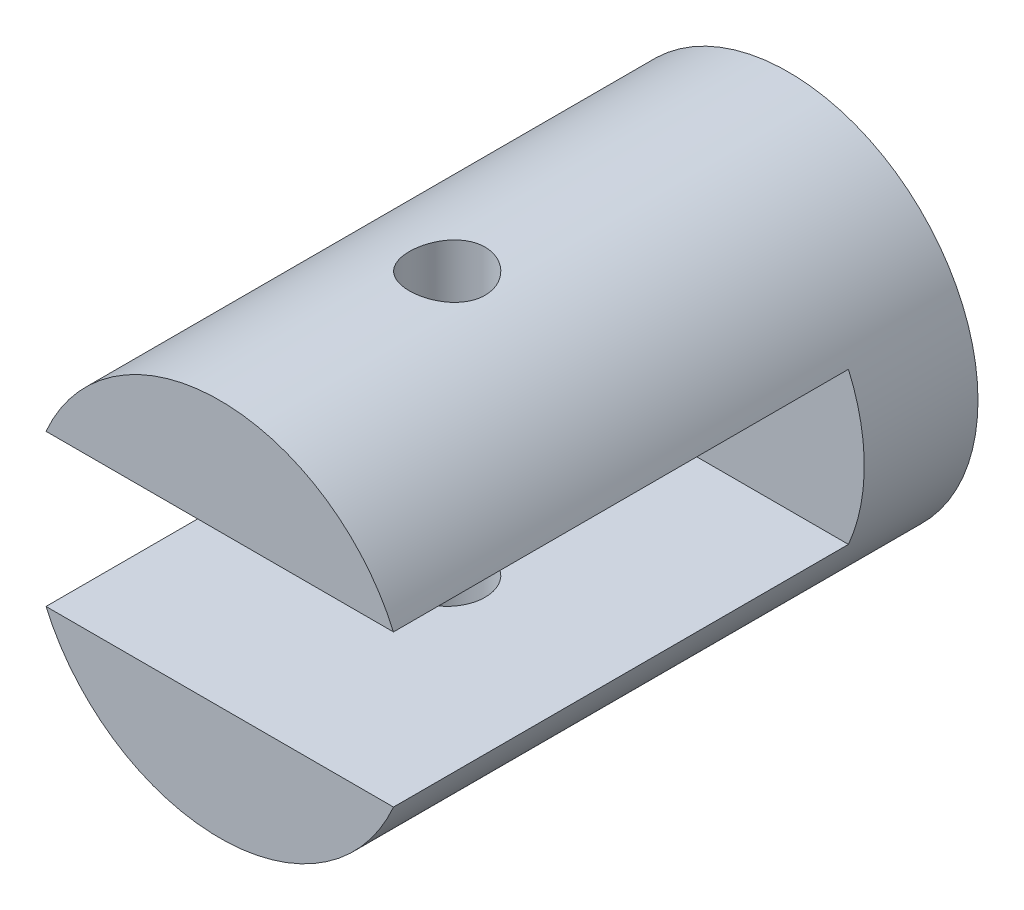
ISO-10303-21;
HEADER;
FILE_DESCRIPTION(('STEP AP214'),'2;1');
FILE_NAME('part.step','',(''),(''),'','','');
FILE_SCHEMA(('AUTOMOTIVE_DESIGN { 1 0 10303 214 1 1 1 1 }'));
ENDSEC;
DATA;
#1=APPLICATION_CONTEXT('core data for automotive mechanical design processes');
#2=APPLICATION_PROTOCOL_DEFINITION('international standard','automotive_design',2000,#1);
#3=PRODUCT_CONTEXT('',#1,'mechanical');
#4=PRODUCT('Part','Part','',(#3));
#5=PRODUCT_RELATED_PRODUCT_CATEGORY('part','',(#4));
#6=PRODUCT_DEFINITION_FORMATION('','',#4);
#7=PRODUCT_DEFINITION_CONTEXT('part definition',#1,'design');
#8=PRODUCT_DEFINITION('design','',#6,#7);
#9=PRODUCT_DEFINITION_SHAPE('','',#8);
#10=(LENGTH_UNIT() NAMED_UNIT(*) SI_UNIT(.MILLI.,.METRE.));
#11=(NAMED_UNIT(*) PLANE_ANGLE_UNIT() SI_UNIT($,.RADIAN.));
#12=(NAMED_UNIT(*) SI_UNIT($,.STERADIAN.) SOLID_ANGLE_UNIT());
#13=UNCERTAINTY_MEASURE_WITH_UNIT(LENGTH_MEASURE(1.E-05),#10,'distance_accuracy_value','');
#14=(GEOMETRIC_REPRESENTATION_CONTEXT(3) GLOBAL_UNCERTAINTY_ASSIGNED_CONTEXT((#13)) GLOBAL_UNIT_ASSIGNED_CONTEXT((#10,
#11,#12)) REPRESENTATION_CONTEXT('',''));
#15=CARTESIAN_POINT('',(0.,0.,0.));
#16=DIRECTION('',(0.,0.,1.));
#17=DIRECTION('',(1.,0.,0.));
#18=AXIS2_PLACEMENT_3D('',#15,#16,#17);
#19=CARTESIAN_POINT('',(0.,0.,150.));
#20=DIRECTION('',(0.,0.,-1.));
#21=DIRECTION('',(-1.,0.,0.));
#22=AXIS2_PLACEMENT_3D('',#19,#20,#21);
#23=CYLINDRICAL_SURFACE('',#22,50.);
#24=CARTESIAN_POINT('',(10.,48.9897948556636,90.));
#25=CARTESIAN_POINT('',(10.0000055578616,48.9897918283549,89.7220847783981));
#26=CARTESIAN_POINT('',(9.98841144603771,48.9921641369852,89.4442389486584));
#27=CARTESIAN_POINT('',(9.94213833787548,49.0015764046158,88.8904726987564));
#28=CARTESIAN_POINT('',(9.90745543866082,49.0086171527579,88.6145526120868));
#29=CARTESIAN_POINT('',(9.81524081728439,49.0271684174694,88.0665239994416));
#30=CARTESIAN_POINT('',(9.75769321098159,49.0386820412274,87.7944182596339));
#31=CARTESIAN_POINT('',(9.62020454716949,49.0658391517098,87.2561293995009));
#32=CARTESIAN_POINT('',(9.5402630362147,49.0814827220595,86.9899463992207));
#33=CARTESIAN_POINT('',(9.35869612354249,49.1164263325939,86.4656405062343));
#34=CARTESIAN_POINT('',(9.25709306997099,49.1357226020175,86.2075096184492));
#35=CARTESIAN_POINT('',(9.03291217053923,49.1774286459406,85.7007842387072));
#36=CARTESIAN_POINT('',(8.9103341340065,49.1998384487433,85.4521898334667));
#37=CARTESIAN_POINT('',(8.64512222098065,49.2471318053851,84.9662679017297));
#38=CARTESIAN_POINT('',(8.50249318144438,49.2720147621958,84.7289376763601));
#39=CARTESIAN_POINT('',(8.19810702556642,49.323573134664,84.266974322581));
#40=CARTESIAN_POINT('',(8.03634361947132,49.350249138472,84.0423454053454));
#41=CARTESIAN_POINT('',(7.69268740274901,49.4049916719914,83.6046146822745));
#42=CARTESIAN_POINT('',(7.51056777345362,49.4330714365766,83.3916925719291));
#43=CARTESIAN_POINT('',(7.12913276455222,49.4895203620957,82.9818930736807));
#44=CARTESIAN_POINT('',(6.92981726818015,49.5178895249937,82.7850157947456));
#45=CARTESIAN_POINT('',(6.51528529882412,49.5741344582697,82.408593120085));
#46=CARTESIAN_POINT('',(6.30006493058503,49.6020101056952,82.229051995149));
#47=CARTESIAN_POINT('',(5.85529185734266,49.6564771957672,81.8886527876062));
#48=CARTESIAN_POINT('',(5.62574420187677,49.683069085069,81.727788179145));
#49=CARTESIAN_POINT('',(5.15168816517143,49.7344693869472,81.4244535791283));
#50=CARTESIAN_POINT('',(4.90706461482463,49.7592597784743,81.2821604351023));
#51=CARTESIAN_POINT('',(4.40642789039347,49.8060899038095,81.018719322489));
#52=CARTESIAN_POINT('',(4.15041462939353,49.8281296166221,80.897571515298));
#53=CARTESIAN_POINT('',(3.62882259251613,49.8688285532245,80.6773513275555));
#54=CARTESIAN_POINT('',(3.3632445104876,49.8874880216333,80.5782773494617));
#55=CARTESIAN_POINT('',(2.82441379724576,49.9208928121788,80.4029717802305));
#56=CARTESIAN_POINT('',(2.55116127820789,49.9356381914938,80.3267398554062));
#57=CARTESIAN_POINT('',(2.00261735532019,49.9606235676341,80.1985813518781));
#58=CARTESIAN_POINT('',(1.72740024469758,49.9709203631728,80.1463477836458));
#59=CARTESIAN_POINT('',(1.17342458405864,49.9869968585911,80.0651400107105));
#60=CARTESIAN_POINT('',(0.894666062085535,49.9927765942171,80.0361656219424));
#61=CARTESIAN_POINT('',(0.335666750513602,49.9996545252133,80.0017132189531));
#62=CARTESIAN_POINT('',(0.0554260881021655,50.0007531159651,79.9962332203344));
#63=CARTESIAN_POINT('',(-0.504504163466099,49.9982385233622,80.0088091932577));
#64=CARTESIAN_POINT('',(-0.784193756899791,49.9946253767207,80.0268649814114));
#65=CARTESIAN_POINT('',(-1.33699925036582,49.9828748708642,80.0859392362088));
#66=CARTESIAN_POINT('',(-1.61015201157261,49.9748027797235,80.1266264917305));
#67=CARTESIAN_POINT('',(-2.15200203444001,49.9544031459421,80.2304053788323));
#68=CARTESIAN_POINT('',(-2.42069934549001,49.9420756505064,80.2934967618851));
#69=CARTESIAN_POINT('',(-2.95177475073919,49.9135026719946,80.4415993430514));
#70=CARTESIAN_POINT('',(-3.21415267967456,49.8972570865751,80.5266111137455));
#71=CARTESIAN_POINT('',(-3.73078612558397,49.8612905421448,80.7179143523683));
#72=CARTESIAN_POINT('',(-3.9850415638256,49.8415695494584,80.8242060264934));
#73=CARTESIAN_POINT('',(-4.48523963661575,49.7990563960151,81.0580032910605));
#74=CARTESIAN_POINT('',(-4.73112205777813,49.7762462239327,81.1856344088102));
#75=CARTESIAN_POINT('',(-5.21137268054887,49.7282601986201,81.4607838747177));
#76=CARTESIAN_POINT('',(-5.44573655275616,49.7030834660865,81.6083096237114));
#77=CARTESIAN_POINT('',(-5.90123233769069,49.6510623813363,81.9221337032397));
#78=CARTESIAN_POINT('',(-6.12236834498708,49.6242185504543,82.0884261782086));
#79=CARTESIAN_POINT('',(-6.55013490621098,49.5695698708425,82.4387698947067));
#80=CARTESIAN_POINT('',(-6.7567587776561,49.5417645880686,82.6228292260086));
#81=CARTESIAN_POINT('',(-7.1575050535464,49.4854704263171,83.0107764723091));
#82=CARTESIAN_POINT('',(-7.35134636517059,49.4569780857237,83.2149543663873));
#83=CARTESIAN_POINT('',(-7.72108497738876,49.4006054039752,83.6388745774332));
#84=CARTESIAN_POINT('',(-7.89699017351828,49.3727247978115,83.8586099731301));
#85=CARTESIAN_POINT('',(-8.2298054566758,49.3183409725417,84.3123383862563));
#86=CARTESIAN_POINT('',(-8.38670707998936,49.2918383701408,84.5463376872336));
#87=CARTESIAN_POINT('',(-8.6802471165353,49.2409940993221,85.0268183767438));
#88=CARTESIAN_POINT('',(-8.81689335189095,49.2166515981926,85.2732948972989));
#89=CARTESIAN_POINT('',(-9.0692882821184,49.1707688715796,85.7777103554598));
#90=CARTESIAN_POINT('',(-9.18498702892672,49.1492353772789,86.03567490886));
#91=CARTESIAN_POINT('',(-9.39420797772629,49.1096752258144,86.5607102372492));
#92=CARTESIAN_POINT('',(-9.48773010393003,49.0916485806352,86.8277810433549));
#93=CARTESIAN_POINT('',(-9.65185242366642,49.0596447407863,87.3690835394382));
#94=CARTESIAN_POINT('',(-9.72245506398431,49.045667113878,87.6433144616534));
#95=CARTESIAN_POINT('',(-9.84017948867802,49.0221835272063,88.19695846087));
#96=CARTESIAN_POINT('',(-9.88730165113419,49.0126774954417,88.476371454355));
#97=CARTESIAN_POINT('',(-9.95707419584056,48.9985501656372,89.0334938776475));
#98=CARTESIAN_POINT('',(-9.98012972622146,48.9938480266228,89.3111505772229));
#99=CARTESIAN_POINT('',(-10.0029960573493,48.9891846061785,89.8674579703996));
#100=CARTESIAN_POINT('',(-10.0028071218982,48.9892232709451,90.1461086526843));
#101=CARTESIAN_POINT('',(-9.97918703880802,48.9940401435875,90.7023660738715));
#102=CARTESIAN_POINT('',(-9.95575712727562,48.9988180993968,90.9799728675065));
#103=CARTESIAN_POINT('',(-9.88584676532503,49.0129707577214,91.5321487396488));
#104=CARTESIAN_POINT('',(-9.8393663641499,49.0223454504167,91.8067178246443));
#105=CARTESIAN_POINT('',(-9.72428351809319,49.0453026490263,92.3482322813401));
#106=CARTESIAN_POINT('',(-9.65589804873987,49.0588438349002,92.6152255690778));
#107=CARTESIAN_POINT('',(-9.49740821528409,49.0897723507519,93.14245270923));
#108=CARTESIAN_POINT('',(-9.40730403243275,49.1071596486325,93.4026866180341));
#109=CARTESIAN_POINT('',(-9.20606122702095,49.1452837515461,93.9145966018224));
#110=CARTESIAN_POINT('',(-9.09492513861577,49.1660201529983,94.1662737035195));
#111=CARTESIAN_POINT('',(-8.85237024489366,49.2102706310058,94.6595173901728));
#112=CARTESIAN_POINT('',(-8.72094374940903,49.2337857599169,94.901080097411));
#113=CARTESIAN_POINT('',(-8.43697778401328,49.2832469384529,95.3753852800111));
#114=CARTESIAN_POINT('',(-8.28419278498115,49.3092199227174,95.6079779591786));
#115=CARTESIAN_POINT('',(-7.95979509378965,49.3626243784483,96.0596206717261));
#116=CARTESIAN_POINT('',(-7.78817389924353,49.3900565056476,96.278664519029));
#117=CARTESIAN_POINT('',(-7.42731319240125,49.4456098940947,96.7016649284306));
#118=CARTESIAN_POINT('',(-7.23807206467689,49.4737312183548,96.9056201040895));
#119=CARTESIAN_POINT('',(-6.84334094822062,49.5298738047839,97.2969785163755));
#120=CARTESIAN_POINT('',(-6.63785815096642,49.5578951055606,97.4843890016978));
#121=CARTESIAN_POINT('',(-6.20856421876563,49.6135193413781,97.8443242999334));
#122=CARTESIAN_POINT('',(-5.98451481601262,49.6411086735589,98.0165671748623));
#123=CARTESIAN_POINT('',(-5.522597302397,49.694616877283,98.3415002753375));
#124=CARTESIAN_POINT('',(-5.28473438524095,49.7205363690319,98.4941977813861));
#125=CARTESIAN_POINT('',(-4.79670875687279,49.7699883268364,98.7790330737425));
#126=CARTESIAN_POINT('',(-4.54654401995986,49.7935203977959,98.911167458968));
#127=CARTESIAN_POINT('',(-4.03569830352663,49.8375245465461,99.153857221364));
#128=CARTESIAN_POINT('',(-3.7750174306389,49.8579966553545,99.2644128172749));
#129=CARTESIAN_POINT('',(-3.24651230707761,49.8951893717178,99.4625229382915));
#130=CARTESIAN_POINT('',(-2.97873771381459,49.9119308611414,99.5502059876501));
#131=CARTESIAN_POINT('',(-2.43653422378758,49.941335634462,99.7027114495028));
#132=CARTESIAN_POINT('',(-2.16210534098541,49.9539989269148,99.7675339099578));
#133=CARTESIAN_POINT('',(-1.60861716095364,49.9748840441433,99.8737911933723));
#134=CARTESIAN_POINT('',(-1.32955833331692,49.9831063165458,99.91522837344));
#135=CARTESIAN_POINT('',(-0.768841200583725,49.9948748562921,99.974384981178));
#136=CARTESIAN_POINT('',(-0.487182930235045,49.9984211860502,99.9921047254278));
#137=CARTESIAN_POINT('',(0.0717276800802542,50.0007159143207,100.003580332937));
#138=CARTESIAN_POINT('',(0.348971307742568,49.999546810247,99.9977482379094));
#139=CARTESIAN_POINT('',(0.90195753962538,49.9926287687395,99.9630928520563));
#140=CARTESIAN_POINT('',(1.17770016243683,49.9868798881597,99.9342698466441));
#141=CARTESIAN_POINT('',(1.72571035480457,49.970962262323,99.8538631468598));
#142=CARTESIAN_POINT('',(1.99797798525158,49.9607935946217,99.8022798518708));
#143=CARTESIAN_POINT('',(2.5371192794373,49.9363179391958,99.6767574138622));
#144=CARTESIAN_POINT('',(2.80399292247573,49.9220109355928,99.6028181850656));
#145=CARTESIAN_POINT('',(3.32983299342737,49.8896926868787,99.4333626318505));
#146=CARTESIAN_POINT('',(3.58881737005974,49.8716907049307,99.3379002074153));
#147=CARTESIAN_POINT('',(4.09789680112225,49.8324437392654,99.1259678938663));
#148=CARTESIAN_POINT('',(4.34798858101113,49.8111975758747,99.0094903602734));
#149=CARTESIAN_POINT('',(4.83747566425149,49.7660450385277,98.7564108721633));
#150=CARTESIAN_POINT('',(5.07687243582105,49.7421390312992,98.6198116910922));
#151=CARTESIAN_POINT('',(5.5434372306874,49.6923068242107,98.3274306387899));
#152=CARTESIAN_POINT('',(5.77060478817657,49.6663805474912,98.171648037609));
#153=CARTESIAN_POINT('',(6.21477842949989,49.6127743752222,97.8393047374352));
#154=CARTESIAN_POINT('',(6.43156156462756,49.5850729423462,97.6624494724557));
#155=CARTESIAN_POINT('',(6.84951320959728,49.5290685957976,97.2912474898841));
#156=CARTESIAN_POINT('',(7.05068156220795,49.500765676072,97.0969005962045));
#157=CARTESIAN_POINT('',(7.43609764481752,49.4443364170545,96.6919800041611));
#158=CARTESIAN_POINT('',(7.62034122332954,49.4162101226549,96.4814023477165));
#159=CARTESIAN_POINT('',(7.97059269000106,49.3609268054785,96.0454799344058));
#160=CARTESIAN_POINT('',(8.13660098100886,49.3337697612982,95.8201355039385));
#161=CARTESIAN_POINT('',(8.4509540290901,49.2808996448581,95.3536296696932));
#162=CARTESIAN_POINT('',(8.59908439031745,49.2552057432466,95.1123215408058));
#163=CARTESIAN_POINT('',(8.87439761284161,49.2063472949326,94.6179110716341));
#164=CARTESIAN_POINT('',(9.0015881657584,49.1831818205456,94.3648131060221));
#165=CARTESIAN_POINT('',(9.23406088388169,49.1400662122481,93.8486577675832));
#166=CARTESIAN_POINT('',(9.33935641430772,49.120114118504,93.5856065870348));
#167=CARTESIAN_POINT('',(9.52729445872567,49.0840074083147,93.0513720042248));
#168=CARTESIAN_POINT('',(9.60994135547565,49.0678520572445,92.7801901866143));
#169=CARTESIAN_POINT('',(9.78661834182527,49.0329882873406,92.0975646227103));
#170=CARTESIAN_POINT('',(9.86652673641837,49.0168802853386,91.6822440954913));
#171=CARTESIAN_POINT('',(9.97321242799326,48.9952860520923,90.8445621672468));
#172=CARTESIAN_POINT('',(9.99999155665262,48.989799454666,90.4222010094594));
#173=CARTESIAN_POINT('',(10.,48.9897948556636,90.));
#174=B_SPLINE_CURVE_WITH_KNOTS('',3,(#24,#25,#26,#27,#28,#29,#30,#31,#32,#33,#34,#35,#36,#37,
#38,#39,#40,#41,#42,#43,#44,#45,#46,#47,#48,#49,#50,#51,#52,#53,#54,#55,#56,#57,#58,#59,#60,#61,
#62,#63,#64,#65,#66,#67,#68,#69,#70,#71,#72,#73,#74,#75,#76,#77,#78,#79,#80,#81,#82,#83,#84,#85,
#86,#87,#88,#89,#90,#91,#92,#93,#94,#95,#96,#97,#98,#99,#100,#101,#102,#103,#104,#105,#106,#107,
#108,#109,#110,#111,#112,#113,#114,#115,#116,#117,#118,#119,#120,#121,#122,#123,#124,#125,#126,
#127,#128,#129,#130,#131,#132,#133,#134,#135,#136,#137,#138,#139,#140,#141,#142,#143,#144,#145,
#146,#147,#148,#149,#150,#151,#152,#153,#154,#155,#156,#157,#158,#159,#160,#161,#162,#163,#164,
#165,#166,#167,#168,#169,#170,#171,#172,#173),.UNSPECIFIED.,.T.,.F.,(4,2,2,2,2,2,2,2,2,2,2,2,2,
2,2,2,2,2,2,2,2,2,2,2,2,2,2,2,2,2,2,2,2,2,2,2,2,2,2,2,2,2,2,2,2,2,2,2,2,2,2,2,2,2,2,2,2,2,2,2,2,
2,2,2,2,2,2,2,2,2,2,2,2,2,4),(0.,0.833374526011494,1.66688995954524,2.50098545260027,
3.33509783615207,4.16835379727626,5.00161733349167,5.83468020315554,6.66801767808775,
7.51179657246023,8.35558119684376,9.19957316140413,10.0432693293038,10.8944900024804,
11.7457171724893,12.596882716871,13.4480358264342,14.2879750327681,15.1279075920529,
15.9677692070405,16.8076242779569,17.6354997343178,18.4633660074012,19.2912539072988,
20.1191498295938,20.9520991398245,21.7853591677624,22.6183599182628,23.4517417639057,
24.2996671685112,25.1472176874031,25.9951443066848,26.8427426200779,27.6923361032982,
28.5419324899202,29.3914381474543,30.240930125889,31.075878708912,31.9108178160905,
32.7457125181471,33.5806054366148,34.4074717648195,35.2343311927419,36.0610910549079,
36.8881650360204,37.7256773853933,38.5635693427199,39.4015381953219,40.2391380689435,
41.0899703784439,41.9404848312855,42.7911398076529,43.641786160631,44.4875442980051,
45.3333006609898,46.1789717611313,47.0246315731737,47.855561147665,48.6864804070119,
49.5173850864896,50.348292954089,51.1771426681663,52.0062944956439,52.8353321445979,
53.6644013490714,54.5068406137978,55.3492883602764,56.1919422024836,57.0345774252985,
57.886482029673,58.7380730104919,59.5891426248342,60.4400474314262,61.7061302862226,
62.9721694909546),.UNSPECIFIED.);
#175=CARTESIAN_POINT('',(10.,48.9897948556636,90.));
#176=VERTEX_POINT('',#175);
#177=EDGE_CURVE('E131',#176,#176,#174,.T.);
#178=ORIENTED_EDGE('',*,*,#177,.F.);
#179=EDGE_LOOP('',(#178));
#180=FACE_BOUND('',#179,.T.);
#181=CARTESIAN_POINT('',(9.99999999999999,-48.9897948556636,90.));
#182=CARTESIAN_POINT('',(10.0000055578615,-48.9897918283549,90.2779152216019));
#183=CARTESIAN_POINT('',(9.9884114460377,-48.9921641369852,90.5557610513416));
#184=CARTESIAN_POINT('',(9.94213833787546,-49.0015764046159,91.1095273012436));
#185=CARTESIAN_POINT('',(9.90745543866081,-49.0086171527579,91.3854473879132));
#186=CARTESIAN_POINT('',(9.81524081728438,-49.0271684174694,91.9334760005584));
#187=CARTESIAN_POINT('',(9.75769321098158,-49.0386820412274,92.2055817403661));
#188=CARTESIAN_POINT('',(9.62020454716948,-49.0658391517098,92.743870600499));
#189=CARTESIAN_POINT('',(9.54026303621469,-49.0814827220595,93.0100536007793));
#190=CARTESIAN_POINT('',(9.35869612354248,-49.1164263325939,93.5343594937656));
#191=CARTESIAN_POINT('',(9.25709306997098,-49.1357226020175,93.7924903815508));
#192=CARTESIAN_POINT('',(9.03291217053922,-49.1774286459406,94.2992157612928));
#193=CARTESIAN_POINT('',(8.91033413400648,-49.1998384487433,94.5478101665333));
#194=CARTESIAN_POINT('',(8.64512222098064,-49.2471318053851,95.0337320982703));
#195=CARTESIAN_POINT('',(8.50249318144437,-49.2720147621958,95.2710623236399));
#196=CARTESIAN_POINT('',(8.19810702556641,-49.323573134664,95.733025677419));
#197=CARTESIAN_POINT('',(8.0363436194713,-49.350249138472,95.9576545946546));
#198=CARTESIAN_POINT('',(7.69268740274901,-49.4049916719914,96.3953853177255));
#199=CARTESIAN_POINT('',(7.51056777345361,-49.4330714365766,96.6083074280709));
#200=CARTESIAN_POINT('',(7.12913276455222,-49.4895203620957,97.0181069263193));
#201=CARTESIAN_POINT('',(6.92981726818014,-49.5178895249937,97.2149842052544));
#202=CARTESIAN_POINT('',(6.51528529882411,-49.5741344582697,97.591406879915));
#203=CARTESIAN_POINT('',(6.30006493058502,-49.6020101056953,97.770948004851));
#204=CARTESIAN_POINT('',(5.85529185734265,-49.6564771957672,98.1113472123938));
#205=CARTESIAN_POINT('',(5.62574420187676,-49.683069085069,98.2722118208549));
#206=CARTESIAN_POINT('',(5.15168816517142,-49.7344693869472,98.5755464208717));
#207=CARTESIAN_POINT('',(4.90706461482462,-49.7592597784743,98.7178395648977));
#208=CARTESIAN_POINT('',(4.40642789039346,-49.8060899038095,98.9812806775109));
#209=CARTESIAN_POINT('',(4.15041462939352,-49.8281296166221,99.102428484702));
#210=CARTESIAN_POINT('',(3.62882259251613,-49.8688285532245,99.3226486724445));
#211=CARTESIAN_POINT('',(3.3632445104876,-49.8874880216333,99.4217226505383));
#212=CARTESIAN_POINT('',(2.82441379724576,-49.9208928121788,99.5970282197694));
#213=CARTESIAN_POINT('',(2.55116127820788,-49.9356381914938,99.6732601445938));
#214=CARTESIAN_POINT('',(2.00261735532018,-49.9606235676341,99.8014186481219));
#215=CARTESIAN_POINT('',(1.72740024469757,-49.9709203631728,99.8536522163542));
#216=CARTESIAN_POINT('',(1.17342458405863,-49.9869968585911,99.9348599892895));
#217=CARTESIAN_POINT('',(0.894666062085521,-49.9927765942171,99.9638343780576));
#218=CARTESIAN_POINT('',(0.335666750513587,-49.9996545252133,99.9982867810468));
#219=CARTESIAN_POINT('',(0.0554260881021501,-50.0007531159651,100.003766779666));
#220=CARTESIAN_POINT('',(-0.504504163466115,-49.9982385233622,99.9911908067423));
#221=CARTESIAN_POINT('',(-0.784193756899806,-49.9946253767207,99.9731350185885));
#222=CARTESIAN_POINT('',(-1.33699925036583,-49.9828748708642,99.9140607637912));
#223=CARTESIAN_POINT('',(-1.61015201157262,-49.9748027797235,99.8733735082695));
#224=CARTESIAN_POINT('',(-2.15200203444002,-49.9544031459421,99.7695946211677));
#225=CARTESIAN_POINT('',(-2.42069934549002,-49.9420756505064,99.7065032381149));
#226=CARTESIAN_POINT('',(-2.9517747507392,-49.9135026719946,99.5584006569486));
#227=CARTESIAN_POINT('',(-3.21415267967457,-49.8972570865751,99.4733888862545));
#228=CARTESIAN_POINT('',(-3.73078612558398,-49.8612905421448,99.2820856476317));
#229=CARTESIAN_POINT('',(-3.98504156382561,-49.8415695494584,99.1757939735066));
#230=CARTESIAN_POINT('',(-4.48523963661576,-49.7990563960151,98.9419967089395));
#231=CARTESIAN_POINT('',(-4.73112205777814,-49.7762462239327,98.8143655911898));
#232=CARTESIAN_POINT('',(-5.21137268054889,-49.72826019862,98.5392161252823));
#233=CARTESIAN_POINT('',(-5.44573655275617,-49.7030834660865,98.3916903762886));
#234=CARTESIAN_POINT('',(-5.9012323376907,-49.6510623813363,98.0778662967603));
#235=CARTESIAN_POINT('',(-6.1223683449871,-49.6242185504543,97.9115738217914));
#236=CARTESIAN_POINT('',(-6.55013490621099,-49.5695698708425,97.5612301052933));
#237=CARTESIAN_POINT('',(-6.75675877765611,-49.5417645880686,97.3771707739914));
#238=CARTESIAN_POINT('',(-7.15750505354641,-49.4854704263171,96.9892235276909));
#239=CARTESIAN_POINT('',(-7.35134636517059,-49.4569780857237,96.7850456336127));
#240=CARTESIAN_POINT('',(-7.72108497738876,-49.4006054039751,96.3611254225668));
#241=CARTESIAN_POINT('',(-7.89699017351829,-49.3727247978115,96.1413900268699));
#242=CARTESIAN_POINT('',(-8.22980545667581,-49.3183409725416,95.6876616137437));
#243=CARTESIAN_POINT('',(-8.38670707998937,-49.2918383701408,95.4536623127664));
#244=CARTESIAN_POINT('',(-8.68024711653531,-49.2409940993221,94.9731816232562));
#245=CARTESIAN_POINT('',(-8.81689335189096,-49.2166515981926,94.7267051027011));
#246=CARTESIAN_POINT('',(-9.06928828211841,-49.1707688715796,94.2222896445402));
#247=CARTESIAN_POINT('',(-9.18498702892673,-49.1492353772789,93.96432509114));
#248=CARTESIAN_POINT('',(-9.3942079777263,-49.1096752258144,93.4392897627508));
#249=CARTESIAN_POINT('',(-9.48773010393004,-49.0916485806352,93.1722189566451));
#250=CARTESIAN_POINT('',(-9.65185242366643,-49.0596447407863,92.6309164605618));
#251=CARTESIAN_POINT('',(-9.72245506398433,-49.045667113878,92.3566855383466));
#252=CARTESIAN_POINT('',(-9.84017948867803,-49.0221835272063,91.80304153913));
#253=CARTESIAN_POINT('',(-9.8873016511342,-49.0126774954417,91.523628545645));
#254=CARTESIAN_POINT('',(-9.95707419584058,-48.9985501656372,90.9665061223525));
#255=CARTESIAN_POINT('',(-9.98012972622147,-48.9938480266228,90.6888494227771));
#256=CARTESIAN_POINT('',(-10.0029960573494,-48.9891846061785,90.1325420296004));
#257=CARTESIAN_POINT('',(-10.0028071218982,-48.9892232709451,89.8538913473157));
#258=CARTESIAN_POINT('',(-9.97918703880803,-48.9940401435875,89.2976339261285));
#259=CARTESIAN_POINT('',(-9.95575712727563,-48.9988180993968,89.0200271324935));
#260=CARTESIAN_POINT('',(-9.88584676532504,-49.0129707577214,88.4678512603512));
#261=CARTESIAN_POINT('',(-9.83936636414991,-49.0223454504167,88.1932821753557));
#262=CARTESIAN_POINT('',(-9.7242835180932,-49.0453026490263,87.6517677186599));
#263=CARTESIAN_POINT('',(-9.65589804873988,-49.0588438349002,87.3847744309222));
#264=CARTESIAN_POINT('',(-9.4974082152841,-49.0897723507519,86.8575472907699));
#265=CARTESIAN_POINT('',(-9.40730403243276,-49.1071596486325,86.5973133819659));
#266=CARTESIAN_POINT('',(-9.20606122702097,-49.1452837515461,86.0854033981776));
#267=CARTESIAN_POINT('',(-9.09492513861579,-49.1660201529983,85.8337262964805));
#268=CARTESIAN_POINT('',(-8.85237024489368,-49.2102706310058,85.3404826098272));
#269=CARTESIAN_POINT('',(-8.72094374940905,-49.2337857599169,85.098919902589));
#270=CARTESIAN_POINT('',(-8.43697778401329,-49.2832469384529,84.6246147199889));
#271=CARTESIAN_POINT('',(-8.28419278498115,-49.3092199227174,84.3920220408214));
#272=CARTESIAN_POINT('',(-7.95979509378965,-49.3626243784483,83.9403793282739));
#273=CARTESIAN_POINT('',(-7.78817389924354,-49.3900565056476,83.721335480971));
#274=CARTESIAN_POINT('',(-7.42731319240126,-49.4456098940947,83.2983350715694));
#275=CARTESIAN_POINT('',(-7.2380720646769,-49.4737312183548,83.0943798959104));
#276=CARTESIAN_POINT('',(-6.84334094822063,-49.5298738047839,82.7030214836245));
#277=CARTESIAN_POINT('',(-6.63785815096643,-49.5578951055606,82.5156109983022));
#278=CARTESIAN_POINT('',(-6.20856421876564,-49.6135193413781,82.1556757000666));
#279=CARTESIAN_POINT('',(-5.98451481601262,-49.6411086735589,81.9834328251377));
#280=CARTESIAN_POINT('',(-5.522597302397,-49.694616877283,81.6584997246625));
#281=CARTESIAN_POINT('',(-5.28473438524095,-49.7205363690319,81.5058022186139));
#282=CARTESIAN_POINT('',(-4.7967087568728,-49.7699883268364,81.2209669262575));
#283=CARTESIAN_POINT('',(-4.54654401995987,-49.7935203977959,81.088832541032));
#284=CARTESIAN_POINT('',(-4.03569830352665,-49.837524546546,80.846142778636));
#285=CARTESIAN_POINT('',(-3.77501743063891,-49.8579966553545,80.7355871827251));
#286=CARTESIAN_POINT('',(-3.24651230707762,-49.8951893717178,80.5374770617085));
#287=CARTESIAN_POINT('',(-2.9787377138146,-49.9119308611414,80.4497940123499));
#288=CARTESIAN_POINT('',(-2.43653422378759,-49.941335634462,80.2972885504972));
#289=CARTESIAN_POINT('',(-2.16210534098542,-49.9539989269148,80.2324660900422));
#290=CARTESIAN_POINT('',(-1.60861716095364,-49.9748840441433,80.1262088066277));
#291=CARTESIAN_POINT('',(-1.32955833331692,-49.9831063165458,80.08477162656));
#292=CARTESIAN_POINT('',(-0.768841200583729,-49.9948748562921,80.025615018822));
#293=CARTESIAN_POINT('',(-0.487182930235053,-49.9984211860502,80.0078952745722));
#294=CARTESIAN_POINT('',(0.0717276800802429,-50.0007159143207,79.9964196670627));
#295=CARTESIAN_POINT('',(0.348971307742557,-49.999546810247,80.0022517620906));
#296=CARTESIAN_POINT('',(0.901957539625369,-49.9926287687395,80.0369071479437));
#297=CARTESIAN_POINT('',(1.17770016243682,-49.9868798881597,80.0657301533559));
#298=CARTESIAN_POINT('',(1.72571035480455,-49.970962262323,80.1461368531402));
#299=CARTESIAN_POINT('',(1.99797798525156,-49.9607935946217,80.1977201481292));
#300=CARTESIAN_POINT('',(2.53711927943728,-49.9363179391958,80.3232425861377));
#301=CARTESIAN_POINT('',(2.80399292247572,-49.9220109355928,80.3971818149344));
#302=CARTESIAN_POINT('',(3.32983299342736,-49.8896926868787,80.5666373681495));
#303=CARTESIAN_POINT('',(3.58881737005973,-49.8716907049307,80.6620997925847));
#304=CARTESIAN_POINT('',(4.09789680112223,-49.8324437392654,80.8740321061337));
#305=CARTESIAN_POINT('',(4.34798858101112,-49.8111975758747,80.9905096397266));
#306=CARTESIAN_POINT('',(4.83747566425148,-49.7660450385277,81.2435891278367));
#307=CARTESIAN_POINT('',(5.07687243582104,-49.7421390312991,81.3801883089078));
#308=CARTESIAN_POINT('',(5.54343723068738,-49.6923068242107,81.6725693612101));
#309=CARTESIAN_POINT('',(5.77060478817656,-49.6663805474912,81.828351962391));
#310=CARTESIAN_POINT('',(6.21477842949987,-49.6127743752222,82.1606952625648));
#311=CARTESIAN_POINT('',(6.43156156462754,-49.5850729423462,82.3375505275443));
#312=CARTESIAN_POINT('',(6.84951320959727,-49.5290685957976,82.7087525101158));
#313=CARTESIAN_POINT('',(7.05068156220793,-49.500765676072,82.9030994037955));
#314=CARTESIAN_POINT('',(7.43609764481751,-49.4443364170545,83.3080199958388));
#315=CARTESIAN_POINT('',(7.62034122332953,-49.4162101226549,83.5185976522835));
#316=CARTESIAN_POINT('',(7.97059269000105,-49.3609268054785,83.9545200655942));
#317=CARTESIAN_POINT('',(8.13660098100885,-49.3337697612982,84.1798644960615));
#318=CARTESIAN_POINT('',(8.45095402909009,-49.2808996448581,84.6463703303068));
#319=CARTESIAN_POINT('',(8.59908439031744,-49.2552057432466,84.8876784591942));
#320=CARTESIAN_POINT('',(8.8743976128416,-49.2063472949326,85.3820889283659));
#321=CARTESIAN_POINT('',(9.00158816575839,-49.1831818205456,85.6351868939779));
#322=CARTESIAN_POINT('',(9.23406088388168,-49.1400662122481,86.1513422324167));
#323=CARTESIAN_POINT('',(9.3393564143077,-49.120114118504,86.4143934129652));
#324=CARTESIAN_POINT('',(9.52729445872565,-49.0840074083147,86.9486279957751));
#325=CARTESIAN_POINT('',(9.60994135547563,-49.0678520572445,87.2198098133857));
#326=CARTESIAN_POINT('',(9.78661834182526,-49.0329882873406,87.9024353772897));
#327=CARTESIAN_POINT('',(9.86652673641835,-49.0168802853386,88.3177559045087));
#328=CARTESIAN_POINT('',(9.97321242799324,-48.9952860520923,89.1554378327532));
#329=CARTESIAN_POINT('',(9.99999155665262,-48.989799454666,89.5777989905406));
#330=CARTESIAN_POINT('',(9.99999999999999,-48.9897948556636,90.));
#331=B_SPLINE_CURVE_WITH_KNOTS('',3,(#181,#182,#183,#184,#185,#186,#187,#188,#189,#190,#191,
#192,#193,#194,#195,#196,#197,#198,#199,#200,#201,#202,#203,#204,#205,#206,#207,#208,#209,#210,
#211,#212,#213,#214,#215,#216,#217,#218,#219,#220,#221,#222,#223,#224,#225,#226,#227,#228,#229,
#230,#231,#232,#233,#234,#235,#236,#237,#238,#239,#240,#241,#242,#243,#244,#245,#246,#247,#248,
#249,#250,#251,#252,#253,#254,#255,#256,#257,#258,#259,#260,#261,#262,#263,#264,#265,#266,#267,
#268,#269,#270,#271,#272,#273,#274,#275,#276,#277,#278,#279,#280,#281,#282,#283,#284,#285,#286,
#287,#288,#289,#290,#291,#292,#293,#294,#295,#296,#297,#298,#299,#300,#301,#302,#303,#304,#305,
#306,#307,#308,#309,#310,#311,#312,#313,#314,#315,#316,#317,#318,#319,#320,#321,#322,#323,#324,
#325,#326,#327,#328,#329,#330),.UNSPECIFIED.,.T.,.F.,(4,2,2,2,2,2,2,2,2,2,2,2,2,2,2,2,2,2,2,2,2,
2,2,2,2,2,2,2,2,2,2,2,2,2,2,2,2,2,2,2,2,2,2,2,2,2,2,2,2,2,2,2,2,2,2,2,2,2,2,2,2,2,2,2,2,2,2,2,2,
2,2,2,2,2,4),(0.,0.83337452601148,1.66688995954524,2.50098545260025,3.33509783615207,
4.16835379727624,5.00161733349167,5.83468020315554,6.66801767808774,7.5117965724602,
8.35558119684376,9.19957316140413,10.0432693293038,10.8944900024804,11.7457171724893,
12.5968827168709,13.4480358264342,14.2879750327681,15.1279075920529,15.9677692070405,
16.8076242779569,17.6354997343178,18.4633660074012,19.2912539072988,20.1191498295938,
20.9520991398245,21.7853591677624,22.6183599182628,23.4517417639056,24.2996671685111,
25.147217687403,25.9951443066848,26.8427426200779,27.6923361032982,28.5419324899202,
29.3914381474543,30.240930125889,31.075878708912,31.9108178160905,32.7457125181471,
33.5806054366148,34.4074717648195,35.2343311927419,36.0610910549079,36.8881650360204,
37.7256773853933,38.5635693427199,39.401538195322,40.2391380689435,41.0899703784439,
41.9404848312854,42.7911398076529,43.641786160631,44.4875442980051,45.3333006609898,
46.1789717611313,47.0246315731737,47.855561147665,48.6864804070119,49.5173850864896,
50.348292954089,51.1771426681663,52.0062944956439,52.8353321445979,53.6644013490713,
54.5068406137978,55.3492883602763,56.1919422024836,57.0345774252985,57.886482029673,
58.7380730104918,59.5891426248342,60.4400474314261,61.7061302862225,62.9721694909546),.UNSPECIFIED.);
#332=CARTESIAN_POINT('',(9.99999999999999,-48.9897948556636,90.));
#333=VERTEX_POINT('',#332);
#334=EDGE_CURVE('E123',#333,#333,#331,.T.);
#335=ORIENTED_EDGE('',*,*,#334,.F.);
#336=EDGE_LOOP('',(#335));
#337=FACE_BOUND('',#336,.T.);
#338=DIRECTION('',(0.,0.,1.));
#339=VECTOR('',#338,1.);
#340=CARTESIAN_POINT('',(45.8257569495584,-20.,30.));
#341=LINE('',#340,#339);
#342=CARTESIAN_POINT('',(45.8257569495584,-20.,30.));
#343=VERTEX_POINT('',#342);
#344=CARTESIAN_POINT('',(45.8257569495584,-20.,150.));
#345=VERTEX_POINT('',#344);
#346=EDGE_CURVE('E85',#343,#345,#341,.T.);
#347=ORIENTED_EDGE('',*,*,#346,.T.);
#348=CARTESIAN_POINT('',(0.,0.,150.));
#349=DIRECTION('',(0.,0.,1.));
#350=DIRECTION('',(1.,0.,0.));
#351=AXIS2_PLACEMENT_3D('',#348,#349,#350);
#352=CIRCLE('',#351,50.);
#353=CARTESIAN_POINT('',(-45.8257569495584,-20.,150.));
#354=VERTEX_POINT('',#353);
#355=EDGE_CURVE('E103',#354,#345,#352,.T.);
#356=ORIENTED_EDGE('',*,*,#355,.F.);
#357=DIRECTION('',(0.,0.,1.));
#358=VECTOR('',#357,1.);
#359=CARTESIAN_POINT('',(-45.8257569495584,-20.,30.));
#360=LINE('',#359,#358);
#361=CARTESIAN_POINT('',(-45.8257569495584,-20.,30.));
#362=VERTEX_POINT('',#361);
#363=EDGE_CURVE('E61',#362,#354,#360,.T.);
#364=ORIENTED_EDGE('',*,*,#363,.F.);
#365=CARTESIAN_POINT('',(0.,0.,30.));
#366=DIRECTION('',(0.,0.,1.));
#367=DIRECTION('',(1.,0.,0.));
#368=AXIS2_PLACEMENT_3D('',#365,#366,#367);
#369=CIRCLE('',#368,50.);
#370=CARTESIAN_POINT('',(-45.8257569495584,20.,30.));
#371=VERTEX_POINT('',#370);
#372=EDGE_CURVE('E13',#371,#362,#369,.T.);
#373=ORIENTED_EDGE('',*,*,#372,.F.);
#374=DIRECTION('',(0.,0.,1.));
#375=VECTOR('',#374,1.);
#376=CARTESIAN_POINT('',(-45.8257569495584,20.,30.));
#377=LINE('',#376,#375);
#378=CARTESIAN_POINT('',(-45.8257569495584,20.,150.));
#379=VERTEX_POINT('',#378);
#380=EDGE_CURVE('E109',#371,#379,#377,.T.);
#381=ORIENTED_EDGE('',*,*,#380,.T.);
#382=CARTESIAN_POINT('',(45.8257569495584,20.,150.));
#383=VERTEX_POINT('',#382);
#384=EDGE_CURVE('E101',#383,#379,#352,.T.);
#385=ORIENTED_EDGE('',*,*,#384,.F.);
#386=DIRECTION('',(0.,0.,1.));
#387=VECTOR('',#386,1.);
#388=CARTESIAN_POINT('',(45.8257569495584,20.,30.));
#389=LINE('',#388,#387);
#390=CARTESIAN_POINT('',(45.8257569495584,20.,30.));
#391=VERTEX_POINT('',#390);
#392=EDGE_CURVE('E100',#391,#383,#389,.T.);
#393=ORIENTED_EDGE('',*,*,#392,.F.);
#394=EDGE_CURVE('E54',#343,#391,#369,.T.);
#395=ORIENTED_EDGE('',*,*,#394,.F.);
#396=EDGE_LOOP('',(#347,#356,#364,#373,#381,#385,#393,#395));
#397=FACE_BOUND('',#396,.T.);
#398=CARTESIAN_POINT('',(0.,0.,0.));
#399=DIRECTION('',(0.,0.,1.));
#400=DIRECTION('',(1.,0.,0.));
#401=AXIS2_PLACEMENT_3D('',#398,#399,#400);
#402=CIRCLE('',#401,50.);
#403=CARTESIAN_POINT('',(50.,0.,0.));
#404=VERTEX_POINT('',#403);
#405=EDGE_CURVE('E106',#404,#404,#402,.T.);
#406=ORIENTED_EDGE('',*,*,#405,.T.);
#407=EDGE_LOOP('',(#406));
#408=FACE_BOUND('',#407,.T.);
#409=ADVANCED_FACE('F46',(#180,#337,#397,#408),#23,.T.);
#410=CARTESIAN_POINT('',(0.,0.,150.));
#411=DIRECTION('',(0.,0.,1.));
#412=DIRECTION('',(1.,0.,0.));
#413=AXIS2_PLACEMENT_3D('',#410,#411,#412);
#414=PLANE('',#413);
#415=ORIENTED_EDGE('',*,*,#384,.T.);
#416=DIRECTION('',(1.,0.,0.));
#417=VECTOR('',#416,1.);
#418=CARTESIAN_POINT('',(-45.8257569495584,20.,150.));
#419=LINE('',#418,#417);
#420=EDGE_CURVE('E114',#379,#383,#419,.T.);
#421=ORIENTED_EDGE('',*,*,#420,.T.);
#422=EDGE_LOOP('',(#415,#421));
#423=FACE_BOUND('',#422,.T.);
#424=ADVANCED_FACE('F150',(#423),#414,.T.);
#425=ORIENTED_EDGE('',*,*,#355,.T.);
#426=DIRECTION('',(-1.,0.,0.));
#427=VECTOR('',#426,1.);
#428=CARTESIAN_POINT('',(45.8257569495584,-20.,150.));
#429=LINE('',#428,#427);
#430=EDGE_CURVE('E88',#345,#354,#429,.T.);
#431=ORIENTED_EDGE('',*,*,#430,.T.);
#432=EDGE_LOOP('',(#425,#431));
#433=FACE_BOUND('',#432,.T.);
#434=ADVANCED_FACE('F152',(#433),#414,.T.);
#435=CARTESIAN_POINT('',(0.,0.,0.));
#436=DIRECTION('',(0.,0.,1.));
#437=DIRECTION('',(1.,0.,0.));
#438=AXIS2_PLACEMENT_3D('',#435,#436,#437);
#439=PLANE('',#438);
#440=ORIENTED_EDGE('',*,*,#405,.F.);
#441=EDGE_LOOP('',(#440));
#442=FACE_BOUND('',#441,.T.);
#443=ADVANCED_FACE('F149',(#442),#439,.F.);
#444=CARTESIAN_POINT('',(0.,0.,30.));
#445=DIRECTION('',(0.,0.,1.));
#446=DIRECTION('',(1.,0.,0.));
#447=AXIS2_PLACEMENT_3D('',#444,#445,#446);
#448=PLANE('',#447);
#449=ORIENTED_EDGE('',*,*,#372,.T.);
#450=DIRECTION('',(-1.,0.,0.));
#451=VECTOR('',#450,1.);
#452=CARTESIAN_POINT('',(45.8257569495584,-20.,30.));
#453=LINE('',#452,#451);
#454=EDGE_CURVE('E87',#343,#362,#453,.T.);
#455=ORIENTED_EDGE('',*,*,#454,.F.);
#456=ORIENTED_EDGE('',*,*,#394,.T.);
#457=DIRECTION('',(1.,0.,0.));
#458=VECTOR('',#457,1.);
#459=CARTESIAN_POINT('',(-45.8257569495584,20.,30.));
#460=LINE('',#459,#458);
#461=EDGE_CURVE('E112',#371,#391,#460,.T.);
#462=ORIENTED_EDGE('',*,*,#461,.F.);
#463=EDGE_LOOP('',(#449,#455,#456,#462));
#464=FACE_BOUND('',#463,.T.);
#465=ADVANCED_FACE('F94',(#464),#448,.T.);
#466=CARTESIAN_POINT('',(-45.8257569495584,20.,30.));
#467=DIRECTION('',(0.,-1.,0.));
#468=DIRECTION('',(0.,0.,-1.));
#469=AXIS2_PLACEMENT_3D('',#466,#467,#468);
#470=PLANE('',#469);
#471=CARTESIAN_POINT('',(0.,20.,90.));
#472=DIRECTION('',(0.,-1.,0.));
#473=DIRECTION('',(0.,0.,-1.));
#474=AXIS2_PLACEMENT_3D('',#471,#472,#473);
#475=CIRCLE('',#474,10.);
#476=CARTESIAN_POINT('',(0.,20.,80.));
#477=VERTEX_POINT('',#476);
#478=EDGE_CURVE('E119',#477,#477,#475,.T.);
#479=ORIENTED_EDGE('',*,*,#478,.F.);
#480=EDGE_LOOP('',(#479));
#481=FACE_BOUND('',#480,.T.);
#482=ORIENTED_EDGE('',*,*,#420,.F.);
#483=ORIENTED_EDGE('',*,*,#380,.F.);
#484=ORIENTED_EDGE('',*,*,#461,.T.);
#485=ORIENTED_EDGE('',*,*,#392,.T.);
#486=EDGE_LOOP('',(#482,#483,#484,#485));
#487=FACE_BOUND('',#486,.T.);
#488=ADVANCED_FACE('F142',(#481,#487),#470,.T.);
#489=CARTESIAN_POINT('',(45.8257569495584,-20.,30.));
#490=DIRECTION('',(0.,1.,0.));
#491=DIRECTION('',(0.,0.,1.));
#492=AXIS2_PLACEMENT_3D('',#489,#490,#491);
#493=PLANE('',#492);
#494=CARTESIAN_POINT('',(0.,-20.,90.));
#495=DIRECTION('',(0.,1.,0.));
#496=DIRECTION('',(0.,0.,1.));
#497=AXIS2_PLACEMENT_3D('',#494,#495,#496);
#498=CIRCLE('',#497,10.);
#499=CARTESIAN_POINT('',(0.,-20.,100.));
#500=VERTEX_POINT('',#499);
#501=EDGE_CURVE('E49',#500,#500,#498,.T.);
#502=ORIENTED_EDGE('',*,*,#501,.F.);
#503=EDGE_LOOP('',(#502));
#504=FACE_BOUND('',#503,.T.);
#505=ORIENTED_EDGE('',*,*,#430,.F.);
#506=ORIENTED_EDGE('',*,*,#346,.F.);
#507=ORIENTED_EDGE('',*,*,#454,.T.);
#508=ORIENTED_EDGE('',*,*,#363,.T.);
#509=EDGE_LOOP('',(#505,#506,#507,#508));
#510=FACE_BOUND('',#509,.T.);
#511=ADVANCED_FACE('F86',(#504,#510),#493,.T.);
#512=CARTESIAN_POINT('',(0.,51.,90.));
#513=DIRECTION('',(0.,-1.,0.));
#514=DIRECTION('',(1.,0.,0.));
#515=AXIS2_PLACEMENT_3D('',#512,#513,#514);
#516=CYLINDRICAL_SURFACE('',#515,10.);
#517=ORIENTED_EDGE('',*,*,#501,.T.);
#518=EDGE_LOOP('',(#517));
#519=FACE_BOUND('',#518,.T.);
#520=ORIENTED_EDGE('',*,*,#334,.T.);
#521=EDGE_LOOP('',(#520));
#522=FACE_BOUND('',#521,.T.);
#523=ADVANCED_FACE('F136',(#519,#522),#516,.F.);
#524=ORIENTED_EDGE('',*,*,#478,.T.);
#525=EDGE_LOOP('',(#524));
#526=FACE_BOUND('',#525,.T.);
#527=ORIENTED_EDGE('',*,*,#177,.T.);
#528=EDGE_LOOP('',(#527));
#529=FACE_BOUND('',#528,.T.);
#530=ADVANCED_FACE('F171',(#526,#529),#516,.F.);
#531=CLOSED_SHELL('',(#409,#424,#434,#443,#465,#488,#511,#523,#530));
#532=MANIFOLD_SOLID_BREP('B2',#531);
#533=ADVANCED_BREP_SHAPE_REPRESENTATION('',(#18,#532),#14);
#534=SHAPE_DEFINITION_REPRESENTATION(#9,#533);
ENDSEC;
END-ISO-10303-21;
